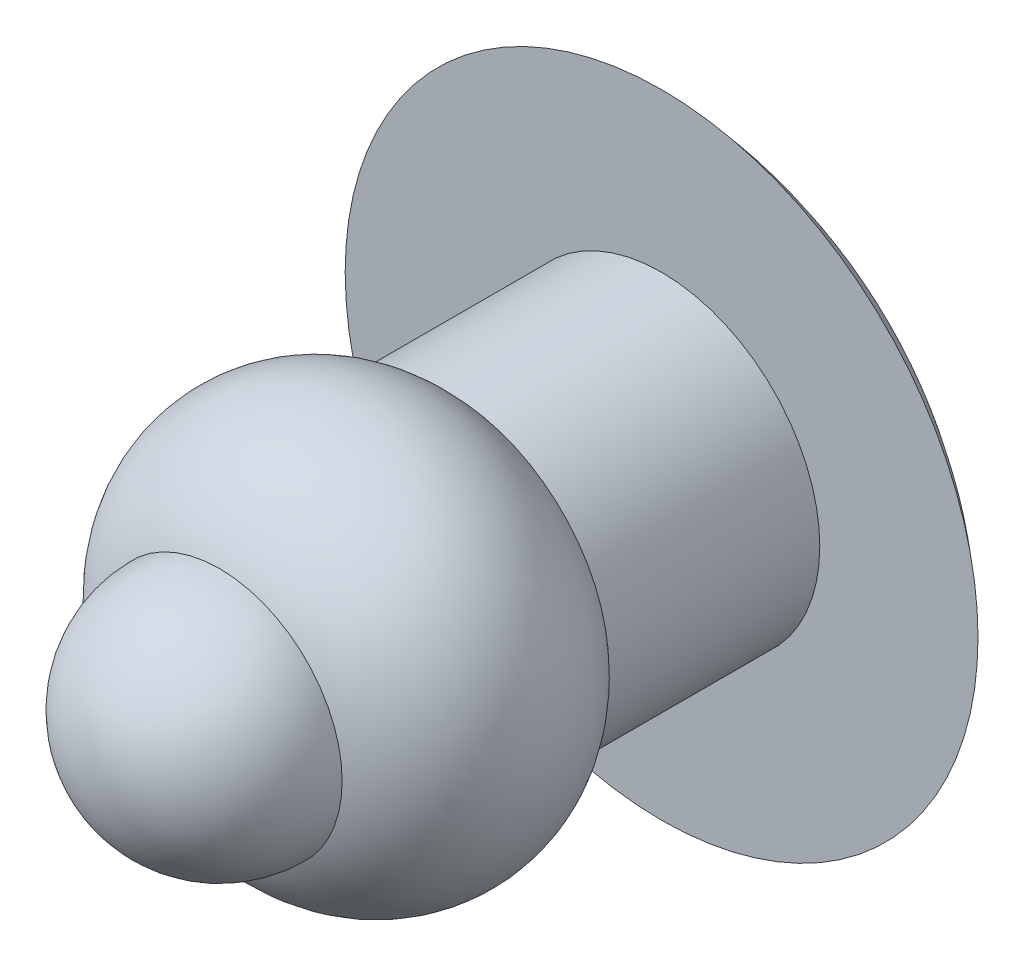
ISO-10303-21;
HEADER;
FILE_DESCRIPTION(('STEP AP214'),'2;1');
FILE_NAME('part.step','',(''),(''),'','','');
FILE_SCHEMA(('AUTOMOTIVE_DESIGN { 1 0 10303 214 1 1 1 1 }'));
ENDSEC;
DATA;
#1=APPLICATION_CONTEXT('core data for automotive mechanical design processes');
#2=APPLICATION_PROTOCOL_DEFINITION('international standard','automotive_design',2000,#1);
#3=PRODUCT_CONTEXT('',#1,'mechanical');
#4=PRODUCT('Part','Part','',(#3));
#5=PRODUCT_RELATED_PRODUCT_CATEGORY('part','',(#4));
#6=PRODUCT_DEFINITION_FORMATION('','',#4);
#7=PRODUCT_DEFINITION_CONTEXT('part definition',#1,'design');
#8=PRODUCT_DEFINITION('design','',#6,#7);
#9=PRODUCT_DEFINITION_SHAPE('','',#8);
#10=(LENGTH_UNIT() NAMED_UNIT(*) SI_UNIT(.MILLI.,.METRE.));
#11=(NAMED_UNIT(*) PLANE_ANGLE_UNIT() SI_UNIT($,.RADIAN.));
#12=(NAMED_UNIT(*) SI_UNIT($,.STERADIAN.) SOLID_ANGLE_UNIT());
#13=UNCERTAINTY_MEASURE_WITH_UNIT(LENGTH_MEASURE(1.E-05),#10,'distance_accuracy_value','');
#14=(GEOMETRIC_REPRESENTATION_CONTEXT(3) GLOBAL_UNCERTAINTY_ASSIGNED_CONTEXT((#13)) GLOBAL_UNIT_ASSIGNED_CONTEXT((#10,
#11,#12)) REPRESENTATION_CONTEXT('',''));
#15=CARTESIAN_POINT('',(0.,0.,0.));
#16=DIRECTION('',(0.,0.,1.));
#17=DIRECTION('',(1.,0.,0.));
#18=AXIS2_PLACEMENT_3D('',#15,#16,#17);
#19=CARTESIAN_POINT('',(0.,0.,2.19206872587707));
#20=DIRECTION('',(0.,0.,-1.));
#21=DIRECTION('',(0.,1.,0.));
#22=AXIS2_PLACEMENT_3D('',#19,#20,#21);
#23=SPHERICAL_SURFACE('',#22,1.16313445334286);
#24=CARTESIAN_POINT('',(0.,0.,2.19206872587707));
#25=DIRECTION('',(0.,0.,-1.));
#26=DIRECTION('',(-1.,0.,0.));
#27=AXIS2_PLACEMENT_3D('',#24,#25,#26);
#28=CIRCLE('',#27,1.16313445334286);
#29=CARTESIAN_POINT('',(-1.16313445334286,0.,2.19206872587707));
#30=VERTEX_POINT('',#29);
#31=EDGE_CURVE('E53',#30,#30,#28,.T.);
#32=ORIENTED_EDGE('',*,*,#31,.F.);
#33=EDGE_LOOP('',(#32));
#34=FACE_BOUND('',#33,.T.);
#35=ADVANCED_FACE('F31',(#34),#23,.T.);
#36=CARTESIAN_POINT('',(0.,1.,-2.83338022744638));
#37=DIRECTION('',(0.,0.,-1.));
#38=DIRECTION('',(-1.,0.,0.));
#39=AXIS2_PLACEMENT_3D('',#36,#37,#38);
#40=PLANE('',#39);
#41=CARTESIAN_POINT('',(0.,0.,-2.83338022744638));
#42=DIRECTION('',(0.,0.,-1.));
#43=DIRECTION('',(-1.,0.,0.));
#44=AXIS2_PLACEMENT_3D('',#41,#42,#43);
#45=CIRCLE('',#44,1.);
#46=CARTESIAN_POINT('',(-1.,0.,-2.83338022744638));
#47=VERTEX_POINT('',#46);
#48=EDGE_CURVE('E10',#47,#47,#45,.T.);
#49=ORIENTED_EDGE('',*,*,#48,.T.);
#50=EDGE_LOOP('',(#49));
#51=FACE_BOUND('',#50,.T.);
#52=ADVANCED_FACE('F61',(#51),#40,.T.);
#53=CARTESIAN_POINT('',(0.,0.,-2.61273209549072));
#54=DIRECTION('',(0.,0.,-1.));
#55=DIRECTION('',(-1.,0.,0.));
#56=AXIS2_PLACEMENT_3D('',#53,#54,#55);
#57=CYLINDRICAL_SURFACE('',#56,1.);
#58=CARTESIAN_POINT('',(0.,0.,-3.03338022744638));
#59=DIRECTION('',(0.,0.,-1.));
#60=DIRECTION('',(-1.,0.,0.));
#61=AXIS2_PLACEMENT_3D('',#58,#59,#60);
#62=CIRCLE('',#61,1.);
#63=CARTESIAN_POINT('',(0.,1.,-3.03338022744638));
#64=VERTEX_POINT('',#63);
#65=EDGE_CURVE('E37',#64,#64,#62,.T.);
#66=ORIENTED_EDGE('',*,*,#65,.T.);
#67=EDGE_LOOP('',(#66));
#68=FACE_BOUND('',#67,.T.);
#69=ORIENTED_EDGE('',*,*,#48,.F.);
#70=EDGE_LOOP('',(#69));
#71=FACE_BOUND('',#70,.T.);
#72=ADVANCED_FACE('F65',(#68,#71),#57,.F.);
#73=CARTESIAN_POINT('',(0.,0.,1.35410196624968));
#74=DIRECTION('',(0.,0.,-1.));
#75=DIRECTION('',(0.,1.,0.));
#76=AXIS2_PLACEMENT_3D('',#73,#74,#75);
#77=SPHERICAL_SURFACE('',#76,4.5);
#78=CARTESIAN_POINT('',(0.,0.,-2.));
#79=DIRECTION('',(0.,0.,-1.));
#80=DIRECTION('',(-1.,0.,0.));
#81=AXIS2_PLACEMENT_3D('',#78,#79,#80);
#82=CIRCLE('',#81,3.);
#83=CARTESIAN_POINT('',(0.,3.,-2.));
#84=VERTEX_POINT('',#83);
#85=EDGE_CURVE('E41',#84,#84,#82,.T.);
#86=CARTESIAN_POINT('',(0.,3.,-2.));
#87=CARTESIAN_POINT('',(0.,2.98233386636404,-2.01580109280683));
#88=CARTESIAN_POINT('',(0.,2.96454287402193,-2.03146258864717));
#89=CARTESIAN_POINT('',(0.,2.92871566207072,-2.06250253194021));
#90=CARTESIAN_POINT('',(0.,2.91067944246162,-2.07788097939292));
#91=CARTESIAN_POINT('',(0.,2.87436626612172,-2.10835097145607));
#92=CARTESIAN_POINT('',(0.,2.85608930939093,-2.12344251606651));
#93=CARTESIAN_POINT('',(0.,2.8192992254629,-2.15333493855676));
#94=CARTESIAN_POINT('',(0.,2.80078609826565,-2.16813581643657));
#95=CARTESIAN_POINT('',(0.,2.76352829462859,-2.19744320907387));
#96=CARTESIAN_POINT('',(0.,2.74478361818877,-2.21194972383136));
#97=CARTESIAN_POINT('',(0.,2.70706739627893,-2.24066476868519));
#98=CARTESIAN_POINT('',(0.,2.68809585080891,-2.25487329878153));
#99=CARTESIAN_POINT('',(0.,2.64993062737758,-2.28298882680745));
#100=CARTESIAN_POINT('',(0.,2.63073694941627,-2.29689582473703));
#101=CARTESIAN_POINT('',(0.,2.59213225308545,-2.32440481630464));
#102=CARTESIAN_POINT('',(0.,2.57272123471594,-2.33800680994268));
#103=CARTESIAN_POINT('',(0.,2.53368670389225,-2.36490239692638));
#104=CARTESIAN_POINT('',(0.,2.51406319143808,-2.37819599027204));
#105=CARTESIAN_POINT('',(0.,2.47460857182789,-2.40447145767512));
#106=CARTESIAN_POINT('',(0.,2.45477746467187,-2.41745333173254));
#107=CARTESIAN_POINT('',(0.,2.41491260686911,-2.44310211938805));
#108=CARTESIAN_POINT('',(0.,2.39487885622237,-2.45576903298613));
#109=CARTESIAN_POINT('',(0.,2.35461371324351,-2.48078473718818));
#110=CARTESIAN_POINT('',(0.,2.33438232091139,-2.49313352779215));
#111=CARTESIAN_POINT('',(0.,2.293726945712,-2.51750990289651));
#112=CARTESIAN_POINT('',(0.,2.27330296284472,-2.5295374873969));
#113=CARTESIAN_POINT('',(0.,2.23226750580914,-2.55326844737987));
#114=CARTESIAN_POINT('',(0.,2.21165603164083,-2.56497182286244));
#115=CARTESIAN_POINT('',(0.,2.17025073804806,-2.58805144284043));
#116=CARTESIAN_POINT('',(0.,2.14945691862359,-2.59942768733585));
#117=CARTESIAN_POINT('',(0.,2.10769212608931,-2.62185020504464));
#118=CARTESIAN_POINT('',(0.,2.0867211529795,-2.63289647825802));
#119=CARTESIAN_POINT('',(0.,2.04460728887514,-2.65465629549143));
#120=CARTESIAN_POINT('',(0.,2.02346439788058,-2.66536983951146));
#121=CARTESIAN_POINT('',(0.,1.98101197672987,-2.68646152351901));
#122=CARTESIAN_POINT('',(0.,1.95970244657371,-2.69683966350654));
#123=CARTESIAN_POINT('',(0.,1.91692206742756,-2.71725794834988));
#124=CARTESIAN_POINT('',(0.,1.89545121843757,-2.72729809320571));
#125=CARTESIAN_POINT('',(0.,1.85235356222783,-2.74703788107335));
#126=CARTESIAN_POINT('',(0.,1.83072675500809,-2.75673752408517));
#127=CARTESIAN_POINT('',(0.,1.78732258188083,-2.77579388656523));
#128=CARTESIAN_POINT('',(0.,1.76554521597332,-2.78515060603346));
#129=CARTESIAN_POINT('',(0.,1.72184536260237,-2.80351878534416));
#130=CARTESIAN_POINT('',(0.,1.69992287513893,-2.81253024518663));
#131=CARTESIAN_POINT('',(0.,1.65593825202026,-2.83020565536405));
#132=CARTESIAN_POINT('',(0.,1.63387611636503,-2.838869605699));
#133=CARTESIAN_POINT('',(0.,1.58961770509289,-2.85584783374262));
#134=CARTESIAN_POINT('',(0.,1.56742142947598,-2.86416211145129));
#135=CARTESIAN_POINT('',(0.,1.52290028000058,-2.88043891842354));
#136=CARTESIAN_POINT('',(0.,1.50057540614209,-2.88840144768713));
#137=CARTESIAN_POINT('',(0.,1.45580263401283,-2.90397276978011));
#138=CARTESIAN_POINT('',(0.,1.43335473574205,-2.9115815626095));
#139=CARTESIAN_POINT('',(0.,1.38834151932466,-2.92644351212833));
#140=CARTESIAN_POINT('',(0.,1.36577620117804,-2.93369666881778));
#141=CARTESIAN_POINT('',(0.,1.3205337788922,-2.94784553526774));
#142=CARTESIAN_POINT('',(0.,1.29785667475296,-2.95474124502826));
#143=CARTESIAN_POINT('',(0.,1.25239634216008,-2.96817349560658));
#144=CARTESIAN_POINT('',(0.,1.22961311370642,-2.97471003642439));
#145=CARTESIAN_POINT('',(0.,1.18394622108623,-2.98742231852411));
#146=CARTESIAN_POINT('',(0.,1.16106255691969,-2.99359805980603));
#147=CARTESIAN_POINT('',(0.,1.11520050495588,-3.00558719580035));
#148=CARTESIAN_POINT('',(0.,1.09222211715862,-3.01140059051275));
#149=CARTESIAN_POINT('',(0.,1.04617635961787,-3.02266360113736));
#150=CARTESIAN_POINT('',(0.,1.02310898987437,-3.02811321704958));
#151=CARTESIAN_POINT('',(0.,1.,-3.03338022744638));
#152=B_SPLINE_CURVE_WITH_KNOTS('',3,(#86,#87,#88,#89,#90,#91,#92,#93,#94,#95,#96,#97,#98,#99,
#100,#101,#102,#103,#104,#105,#106,#107,#108,#109,#110,#111,#112,#113,#114,#115,#116,#117,#118,
#119,#120,#121,#122,#123,#124,#125,#126,#127,#128,#129,#130,#131,#132,#133,#134,#135,#136,#137,
#138,#139,#140,#141,#142,#143,#144,#145,#146,#147,#148,#149,#150,#151),.UNSPECIFIED.,.F.,.F.,(4,
2,2,2,2,2,2,2,2,2,2,2,2,2,2,2,2,2,2,2,2,2,2,2,2,2,2,2,2,2,2,2,4),(0.,0.0711041208441618,
0.142208241688324,0.213312362532485,0.284416483376646,0.355520604220809,0.42662472506497,
0.497728845909131,0.568832966753293,0.639937087597454,0.711041208441616,0.782145329285778,
0.853249450129939,0.924353570974101,0.995457691818262,1.06656181266242,1.13766593350659,
1.20877005435075,1.27987417519491,1.35097829603907,1.42208241688323,1.49318653772739,
1.56429065857155,1.63539477941572,1.70649890025988,1.77760302110404,1.8487071419482,
1.91981126279236,1.99091538363652,2.06201950448069,2.13312362532485,2.20422774616901,
2.27533186701317),.UNSPECIFIED.);
#153=EDGE_CURVE('BSEAM69',#84,#64,#152,.T.);
#154=ORIENTED_EDGE('',*,*,#85,.T.);
#155=ORIENTED_EDGE('',*,*,#65,.F.);
#156=ORIENTED_EDGE('',*,*,#153,.T.);
#157=ORIENTED_EDGE('',*,*,#153,.F.);
#158=EDGE_LOOP('',(#154,#156,#155,#157));
#159=FACE_BOUND('',#158,.T.);
#160=ADVANCED_FACE('F69',(#159),#77,.T.);
#161=CARTESIAN_POINT('',(0.,1.5,-2.));
#162=DIRECTION('',(0.,0.,1.));
#163=DIRECTION('',(1.,0.,0.));
#164=AXIS2_PLACEMENT_3D('',#161,#162,#163);
#165=PLANE('',#164);
#166=CARTESIAN_POINT('',(0.,0.,-2.));
#167=DIRECTION('',(0.,0.,-1.));
#168=DIRECTION('',(-1.,0.,0.));
#169=AXIS2_PLACEMENT_3D('',#166,#167,#168);
#170=CIRCLE('',#169,1.5);
#171=CARTESIAN_POINT('',(-1.5,0.,-2.));
#172=VERTEX_POINT('',#171);
#173=EDGE_CURVE('E45',#172,#172,#170,.T.);
#174=ORIENTED_EDGE('',*,*,#173,.T.);
#175=EDGE_LOOP('',(#174));
#176=FACE_BOUND('',#175,.T.);
#177=ORIENTED_EDGE('',*,*,#85,.F.);
#178=EDGE_LOOP('',(#177));
#179=FACE_BOUND('',#178,.T.);
#180=ADVANCED_FACE('F74',(#176,#179),#165,.T.);
#181=CARTESIAN_POINT('',(0.,0.,-2.61273209549072));
#182=DIRECTION('',(0.,0.,-1.));
#183=DIRECTION('',(-1.,0.,0.));
#184=AXIS2_PLACEMENT_3D('',#181,#182,#183);
#185=CYLINDRICAL_SURFACE('',#184,1.5);
#186=CARTESIAN_POINT('',(0.,0.,0.));
#187=DIRECTION('',(0.,0.,-1.));
#188=DIRECTION('',(-1.,0.,0.));
#189=AXIS2_PLACEMENT_3D('',#186,#187,#188);
#190=CIRCLE('',#189,1.5);
#191=CARTESIAN_POINT('',(-1.5,0.,0.));
#192=VERTEX_POINT('',#191);
#193=EDGE_CURVE('E50',#192,#192,#190,.T.);
#194=ORIENTED_EDGE('',*,*,#193,.T.);
#195=EDGE_LOOP('',(#194));
#196=FACE_BOUND('',#195,.T.);
#197=ORIENTED_EDGE('',*,*,#173,.F.);
#198=EDGE_LOOP('',(#197));
#199=FACE_BOUND('',#198,.T.);
#200=ADVANCED_FACE('F78',(#196,#199),#185,.T.);
#201=CARTESIAN_POINT('',(0.,0.,0.990422409234364));
#202=DIRECTION('',(0.,0.,-1.));
#203=DIRECTION('',(-1.,0.,0.));
#204=AXIS2_PLACEMENT_3D('',#201,#202,#203);
#205=DEGENERATE_TOROIDAL_SURFACE('',#204,0.644323716342024,1.30886150952969,.T.);
#206=ORIENTED_EDGE('',*,*,#31,.T.);
#207=EDGE_LOOP('',(#206));
#208=FACE_BOUND('',#207,.T.);
#209=ORIENTED_EDGE('',*,*,#193,.F.);
#210=EDGE_LOOP('',(#209));
#211=FACE_BOUND('',#210,.T.);
#212=ADVANCED_FACE('F57',(#208,#211),#205,.T.);
#213=CLOSED_SHELL('',(#35,#52,#72,#160,#180,#200,#212));
#214=MANIFOLD_SOLID_BREP('B2',#213);
#215=ADVANCED_BREP_SHAPE_REPRESENTATION('',(#18,#214),#14);
#216=SHAPE_DEFINITION_REPRESENTATION(#9,#215);
ENDSEC;
END-ISO-10303-21;
